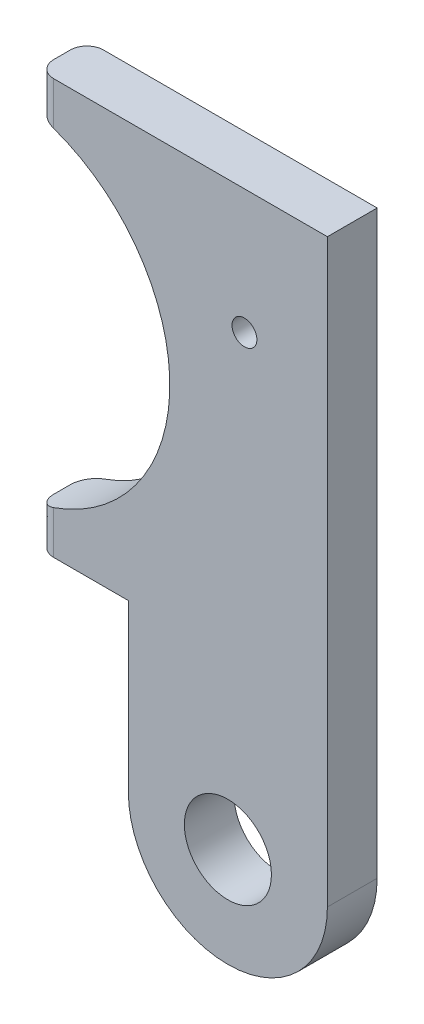
ISO-10303-21;
HEADER;
FILE_DESCRIPTION(('STEP AP214'),'2;1');
FILE_NAME('part.step','',(''),(''),'','','');
FILE_SCHEMA(('AUTOMOTIVE_DESIGN { 1 0 10303 214 1 1 1 1 }'));
ENDSEC;
DATA;
#1=APPLICATION_CONTEXT('core data for automotive mechanical design processes');
#2=APPLICATION_PROTOCOL_DEFINITION('international standard','automotive_design',2000,#1);
#3=PRODUCT_CONTEXT('',#1,'mechanical');
#4=PRODUCT('Part','Part','',(#3));
#5=PRODUCT_RELATED_PRODUCT_CATEGORY('part','',(#4));
#6=PRODUCT_DEFINITION_FORMATION('','',#4);
#7=PRODUCT_DEFINITION_CONTEXT('part definition',#1,'design');
#8=PRODUCT_DEFINITION('design','',#6,#7);
#9=PRODUCT_DEFINITION_SHAPE('','',#8);
#10=(LENGTH_UNIT() NAMED_UNIT(*) SI_UNIT(.MILLI.,.METRE.));
#11=(NAMED_UNIT(*) PLANE_ANGLE_UNIT() SI_UNIT($,.RADIAN.));
#12=(NAMED_UNIT(*) SI_UNIT($,.STERADIAN.) SOLID_ANGLE_UNIT());
#13=UNCERTAINTY_MEASURE_WITH_UNIT(LENGTH_MEASURE(1.E-05),#10,'distance_accuracy_value','');
#14=(GEOMETRIC_REPRESENTATION_CONTEXT(3) GLOBAL_UNCERTAINTY_ASSIGNED_CONTEXT((#13)) GLOBAL_UNIT_ASSIGNED_CONTEXT((#10,
#11,#12)) REPRESENTATION_CONTEXT('',''));
#15=CARTESIAN_POINT('',(0.,0.,0.));
#16=DIRECTION('',(0.,0.,1.));
#17=DIRECTION('',(1.,0.,0.));
#18=AXIS2_PLACEMENT_3D('',#15,#16,#17);
#19=CARTESIAN_POINT('',(-11.5,0.,3.));
#20=DIRECTION('',(1.,0.,0.));
#21=DIRECTION('',(0.,1.,0.));
#22=AXIS2_PLACEMENT_3D('',#19,#20,#21);
#23=PLANE('',#22);
#24=CARTESIAN_POINT('',(-11.5,85.,1.));
#25=CARTESIAN_POINT('',(-11.5,68.3333333333333,1.));
#26=CARTESIAN_POINT('',(-11.5,51.6666666666667,1.));
#27=CARTESIAN_POINT('',(-11.5,35.,1.));
#28=CARTESIAN_POINT('',(-11.5,26.6666666666667,1.));
#29=CARTESIAN_POINT('',(-11.5,18.3333333333333,1.));
#30=CARTESIAN_POINT('',(-11.5,10.,1.));
#31=CARTESIAN_POINT('',(-11.5,-6.66666666666667,1.));
#32=CARTESIAN_POINT('',(-11.5,-23.3333333333333,1.));
#33=CARTESIAN_POINT('',(-11.5,-40.,1.));
#34=(BOUNDED_CURVE() B_SPLINE_CURVE(3,(#24,#25,#26,#27,#28,#29,#30,#31,#32,#33),.UNSPECIFIED.,
.F.,.F.) B_SPLINE_CURVE_WITH_KNOTS((4,3,3,4),(-0.085,-0.035,-0.01,0.04),
.UNSPECIFIED.) CURVE() GEOMETRIC_REPRESENTATION_ITEM() RATIONAL_B_SPLINE_CURVE((1.,1.,1.,1.,1.,
1.,1.,1.,1.,1.)) REPRESENTATION_ITEM(''));
#35=CARTESIAN_POINT('',(-11.5,35.,1.));
#36=VERTEX_POINT('',#35);
#37=CARTESIAN_POINT('',(-11.5,32.6980390271856,1.));
#38=VERTEX_POINT('',#37);
#39=EDGE_CURVE('E174',#36,#38,#34,.T.);
#40=ORIENTED_EDGE('',*,*,#39,.T.);
#41=DIRECTION('',(0.,0.,1.));
#42=VECTOR('',#41,1.);
#43=CARTESIAN_POINT('',(-11.5,32.6980390271856,-0.057371207120285));
#44=LINE('',#43,#42);
#45=CARTESIAN_POINT('',(-11.5,32.6980390271856,2.));
#46=VERTEX_POINT('',#45);
#47=EDGE_CURVE('E164',#46,#38,#44,.F.);
#48=ORIENTED_EDGE('',*,*,#47,.F.);
#49=CARTESIAN_POINT('',(-11.5,85.,2.));
#50=CARTESIAN_POINT('',(-11.5,68.3333333333333,2.));
#51=CARTESIAN_POINT('',(-11.5,51.6666666666667,2.));
#52=CARTESIAN_POINT('',(-11.5,35.,2.));
#53=CARTESIAN_POINT('',(-11.5,26.6666666666667,2.));
#54=CARTESIAN_POINT('',(-11.5,18.3333333333333,2.));
#55=CARTESIAN_POINT('',(-11.5,10.,2.));
#56=CARTESIAN_POINT('',(-11.5,-6.66666666666667,2.));
#57=CARTESIAN_POINT('',(-11.5,-23.3333333333333,2.));
#58=CARTESIAN_POINT('',(-11.5,-40.,2.));
#59=(BOUNDED_CURVE() B_SPLINE_CURVE(3,(#49,#50,#51,#52,#53,#54,#55,#56,#57,#58),.UNSPECIFIED.,
.F.,.F.) B_SPLINE_CURVE_WITH_KNOTS((4,3,3,4),(-0.085,-0.035,-0.01,0.04),
.UNSPECIFIED.) CURVE() GEOMETRIC_REPRESENTATION_ITEM() RATIONAL_B_SPLINE_CURVE((1.,1.,1.,1.,1.,
1.,1.,1.,1.,1.)) REPRESENTATION_ITEM(''));
#60=CARTESIAN_POINT('',(-11.5,35.,2.));
#61=VERTEX_POINT('',#60);
#62=EDGE_CURVE('E172',#46,#61,#59,.F.);
#63=ORIENTED_EDGE('',*,*,#62,.T.);
#64=DIRECTION('',(0.,0.,-1.));
#65=VECTOR('',#64,1.);
#66=CARTESIAN_POINT('',(-11.5,35.,3.));
#67=LINE('',#66,#65);
#68=EDGE_CURVE('E483',#61,#36,#67,.T.);
#69=ORIENTED_EDGE('',*,*,#68,.T.);
#70=EDGE_LOOP('',(#40,#48,#63,#69));
#71=FACE_BOUND('',#70,.T.);
#72=ADVANCED_FACE('F54',(#71),#23,.F.);
#73=CARTESIAN_POINT('',(-11.5,40.,1.));
#74=CARTESIAN_POINT('',(-11.5,38.3333333333333,1.));
#75=CARTESIAN_POINT('',(-11.5,36.6666666666667,1.));
#76=CARTESIAN_POINT('',(-11.5,35.,1.));
#77=CARTESIAN_POINT('',(-11.5,26.6666666666667,1.));
#78=CARTESIAN_POINT('',(-11.5,18.3333333333333,1.));
#79=CARTESIAN_POINT('',(-11.5,10.,1.));
#80=CARTESIAN_POINT('',(-11.5,8.33333333333333,1.));
#81=CARTESIAN_POINT('',(-11.5,6.66666666666666,1.));
#82=CARTESIAN_POINT('',(-11.5,5.,1.));
#83=CARTESIAN_POINT('',(-11.5,40.,0.));
#84=CARTESIAN_POINT('',(-11.5,38.3333333333333,0.));
#85=CARTESIAN_POINT('',(-11.5,36.6666666666667,0.));
#86=CARTESIAN_POINT('',(-11.5,35.,0.));
#87=CARTESIAN_POINT('',(-11.5,26.6666666666667,0.));
#88=CARTESIAN_POINT('',(-11.5,18.3333333333333,0.));
#89=CARTESIAN_POINT('',(-11.5,10.,0.));
#90=CARTESIAN_POINT('',(-11.5,8.33333333333333,0.));
#91=CARTESIAN_POINT('',(-11.5,6.66666666666666,0.));
#92=CARTESIAN_POINT('',(-11.5,5.,0.));
#93=CARTESIAN_POINT('',(-10.5,40.,0.));
#94=CARTESIAN_POINT('',(-10.5,38.3333333333333,0.));
#95=CARTESIAN_POINT('',(-10.5,36.6666666666667,0.));
#96=CARTESIAN_POINT('',(-10.5,35.,0.));
#97=CARTESIAN_POINT('',(-10.5,26.6666666666667,0.));
#98=CARTESIAN_POINT('',(-10.5,18.3333333333333,0.));
#99=CARTESIAN_POINT('',(-10.5,10.,0.));
#100=CARTESIAN_POINT('',(-10.5,8.33333333333333,0.));
#101=CARTESIAN_POINT('',(-10.5,6.66666666666666,0.));
#102=CARTESIAN_POINT('',(-10.5,5.,0.));
#103=(BOUNDED_SURFACE() B_SPLINE_SURFACE(2,3,((#73,#74,#75,#76,#77,#78,#79,#80,#81,#82),(#83,
#84,#85,#86,#87,#88,#89,#90,#91,#92),(#93,#94,#95,#96,#97,#98,#99,#100,#101,#102)),
.UNSPECIFIED.,.F.,.F.,.F.) B_SPLINE_SURFACE_WITH_KNOTS((3,3),(4,3,3,4),(0.,1.),(-0.04,-0.035,
-0.01,-0.005),.UNSPECIFIED.) GEOMETRIC_REPRESENTATION_ITEM() RATIONAL_B_SPLINE_SURFACE(((1.,1.,
1.,1.,1.,1.,1.,1.,1.,1.),(0.707106781186548,0.707106781186548,0.707106781186548,
0.707106781186548,0.707106781186548,0.707106781186548,0.707106781186548,0.707106781186548,
0.707106781186548,0.707106781186548),(1.,1.,1.,1.,1.,1.,1.,1.,1.,1.))) REPRESENTATION_ITEM('') SURFACE());
#104=CARTESIAN_POINT('',(-11.5,12.3019609728144,1.));
#105=CARTESIAN_POINT('',(-11.5000002111957,12.3019615692368,0.972523911067477));
#106=CARTESIAN_POINT('',(-11.4988668428944,12.3022386891917,0.94506111821244));
#107=CARTESIAN_POINT('',(-11.4943481477857,12.3033477651507,0.890336327826097));
#108=CARTESIAN_POINT('',(-11.4909631148035,12.3041796487624,0.863074304565112));
#109=CARTESIAN_POINT('',(-11.4774728691763,12.3075053049876,0.781960112831982));
#110=CARTESIAN_POINT('',(-11.4640323550568,12.3108290749227,0.728656291368002));
#111=CARTESIAN_POINT('',(-11.4286959627983,12.3196894402152,0.625139779720297));
#112=CARTESIAN_POINT('',(-11.4067975055738,12.3252267105546,0.57492803782637));
#113=CARTESIAN_POINT('',(-11.3552674528248,12.3384993804894,0.478960402972967));
#114=CARTESIAN_POINT('',(-11.3256360275927,12.3462347316799,0.43320441192115));
#115=CARTESIAN_POINT('',(-11.2593044306694,12.363937024025,0.346974294917843));
#116=CARTESIAN_POINT('',(-11.2225438780983,12.3739231547606,0.306550630604498));
#117=CARTESIAN_POINT('',(-11.1432891797356,12.39599620057,0.232456536205179));
#118=CARTESIAN_POINT('',(-11.1007936518868,12.4080836222316,0.198787738835971));
#119=CARTESIAN_POINT('',(-11.0101586950385,12.4345574455655,0.138146716650751));
#120=CARTESIAN_POINT('',(-10.9618981910819,12.4489969452857,0.111379003370732));
#121=CARTESIAN_POINT('',(-10.8621203487379,12.4796988369225,0.0662616889894607));
#122=CARTESIAN_POINT('',(-10.8106022444382,12.4959616582304,0.0479140760206935));
#123=CARTESIAN_POINT('',(-10.7158276635642,12.5267261175497,0.022583647695032));
#124=CARTESIAN_POINT('',(-10.6728797709566,12.5409680823307,0.0140967926244136));
#125=CARTESIAN_POINT('',(-10.5865862186252,12.5702109084282,0.00280527983994801));
#126=CARTESIAN_POINT('',(-10.5432414405831,12.5852103187585,-9.84894708422682E-06));
#127=CARTESIAN_POINT('',(-10.5,12.6005050633883,0.));
#128=B_SPLINE_CURVE_WITH_KNOTS('',3,(#104,#105,#106,#107,#108,#109,#110,#111,#112,#113,#114,
#115,#116,#117,#118,#119,#120,#121,#122,#123,#124,#125,#126,#127),.UNSPECIFIED.,.F.,.F.,(4,2,2,
2,2,2,2,2,2,2,2,4),(0.,0.0823771619850113,0.164743576478983,0.329110573803168,0.493527731274838,
0.657941268321545,0.823813465212696,0.989725706845216,1.16010119557458,1.33051689225556,
1.4682771805447,1.60578290352192),.UNSPECIFIED.);
#129=CARTESIAN_POINT('',(-11.5,12.3019609728144,1.));
#130=VERTEX_POINT('',#129);
#131=CARTESIAN_POINT('',(-10.5,12.6005050633883,0.));
#132=VERTEX_POINT('',#131);
#133=EDGE_CURVE('E153',#130,#132,#128,.T.);
#134=CARTESIAN_POINT('',(-10.5,85.,0.));
#135=CARTESIAN_POINT('',(-10.5,68.3333333333333,0.));
#136=CARTESIAN_POINT('',(-10.5,51.6666666666667,0.));
#137=CARTESIAN_POINT('',(-10.5,35.,0.));
#138=CARTESIAN_POINT('',(-10.5,26.6666666666667,0.));
#139=CARTESIAN_POINT('',(-10.5,18.3333333333333,0.));
#140=CARTESIAN_POINT('',(-10.5,10.,0.));
#141=CARTESIAN_POINT('',(-10.5,-6.66666666666667,0.));
#142=CARTESIAN_POINT('',(-10.5,-23.3333333333333,0.));
#143=CARTESIAN_POINT('',(-10.5,-40.,0.));
#144=(BOUNDED_CURVE() B_SPLINE_CURVE(3,(#134,#135,#136,#137,#138,#139,#140,#141,#142,#143),
.UNSPECIFIED.,.F.,.F.) B_SPLINE_CURVE_WITH_KNOTS((4,3,3,4),(-0.085,-0.035,-0.01,0.04),
.UNSPECIFIED.) CURVE() GEOMETRIC_REPRESENTATION_ITEM() RATIONAL_B_SPLINE_CURVE((1.,1.,1.,1.,1.,
1.,1.,1.,1.,1.)) REPRESENTATION_ITEM(''));
#145=CARTESIAN_POINT('',(-10.5,10.,0.));
#146=VERTEX_POINT('',#145);
#147=EDGE_CURVE('E216',#146,#132,#144,.F.);
#148=CARTESIAN_POINT('',(-11.5,10.,1.));
#149=CARTESIAN_POINT('',(-11.4999997996185,10.,0.971865254432972));
#150=CARTESIAN_POINT('',(-11.4988119032098,10.,0.943743998294751));
#151=CARTESIAN_POINT('',(-11.4940728849558,10.,0.88770268367173));
#152=CARTESIAN_POINT('',(-11.4905218736389,10.,0.859782615838623));
#153=CARTESIAN_POINT('',(-11.4763578457214,10.,0.776673062715144));
#154=CARTESIAN_POINT('',(-11.4622337417672,10.,0.722040247925385));
#155=CARTESIAN_POINT('',(-11.4250149037354,10.,0.615923079973702));
#156=CARTESIAN_POINT('',(-11.4019158622525,10.,0.564440252360828));
#157=CARTESIAN_POINT('',(-11.3474030418845,10.,0.466083923996782));
#158=CARTESIAN_POINT('',(-11.3159907277453,10.,0.419209613247622));
#159=CARTESIAN_POINT('',(-11.2457470917003,10.,0.331400542138593));
#160=CARTESIAN_POINT('',(-11.2069150570088,10.,0.290466353089878));
#161=CARTESIAN_POINT('',(-11.1229041961312,10.,0.215686012738716));
#162=CARTESIAN_POINT('',(-11.0777254722674,10.,0.181839747185592));
#163=CARTESIAN_POINT('',(-11.0062109947204,10.,0.137129745737251));
#164=CARTESIAN_POINT('',(-10.9817269025462,10.,0.123227438478842));
#165=CARTESIAN_POINT('',(-10.9316995735737,10.,0.097544618643551));
#166=CARTESIAN_POINT('',(-10.9061572983413,10.,0.0857622295688718));
#167=CARTESIAN_POINT('',(-10.8281796273028,10.,0.0537191639682964));
#168=CARTESIAN_POINT('',(-10.7743436000231,10.,0.0367315233233404));
#169=CARTESIAN_POINT('',(-10.6834905911766,10.,0.0162826143833998));
#170=CARTESIAN_POINT('',(-10.647036002075,10.,0.0101806058722241));
#171=CARTESIAN_POINT('',(-10.5737283254992,10.,0.00204095716132475));
#172=CARTESIAN_POINT('',(-10.5368758777553,10.,-2.44500328447076E-06));
#173=CARTESIAN_POINT('',(-10.5,10.,0.));
#174=B_SPLINE_CURVE_WITH_KNOTS('',3,(#148,#149,#150,#151,#152,#153,#154,#155,#156,#157,#158,
#159,#160,#161,#162,#163,#164,#165,#166,#167,#168,#169,#170,#171,#172,#173),.UNSPECIFIED.,.F.,
.F.,(4,2,2,2,2,2,2,2,2,2,2,2,4),(0.,0.0843523719680465,0.16870079885765,0.337119301179932,
0.505618733832972,0.674088497696926,0.842574453982349,1.01105769422313,1.09543727445699,
1.17974179257302,1.34817695086743,1.45885920377359,1.56938420949917),.UNSPECIFIED.);
#175=CARTESIAN_POINT('',(-11.5,10.,1.));
#176=VERTEX_POINT('',#175);
#177=EDGE_CURVE('E217',#176,#146,#174,.T.);
#178=EDGE_CURVE('E171',#130,#176,#34,.T.);
#179=ORIENTED_EDGE('',*,*,#133,.T.);
#180=ORIENTED_EDGE('',*,*,#147,.F.);
#181=ORIENTED_EDGE('',*,*,#177,.F.);
#182=ORIENTED_EDGE('',*,*,#178,.F.);
#183=EDGE_LOOP('',(#179,#180,#181,#182));
#184=FACE_BOUND('',#183,.T.);
#185=ADVANCED_FACE('F270',(#184),#103,.T.);
#186=CARTESIAN_POINT('',(-10.5,40.,3.));
#187=CARTESIAN_POINT('',(-10.5,38.3333333333333,3.));
#188=CARTESIAN_POINT('',(-10.5,36.6666666666667,3.));
#189=CARTESIAN_POINT('',(-10.5,35.,3.));
#190=CARTESIAN_POINT('',(-10.5,26.6666666666667,3.));
#191=CARTESIAN_POINT('',(-10.5,18.3333333333333,3.));
#192=CARTESIAN_POINT('',(-10.5,10.,3.));
#193=CARTESIAN_POINT('',(-10.5,8.33333333333334,3.));
#194=CARTESIAN_POINT('',(-10.5,6.66666666666667,3.));
#195=CARTESIAN_POINT('',(-10.5,5.,3.));
#196=CARTESIAN_POINT('',(-11.5,40.,3.));
#197=CARTESIAN_POINT('',(-11.5,38.3333333333333,3.));
#198=CARTESIAN_POINT('',(-11.5,36.6666666666667,3.));
#199=CARTESIAN_POINT('',(-11.5,35.,3.));
#200=CARTESIAN_POINT('',(-11.5,26.6666666666667,3.));
#201=CARTESIAN_POINT('',(-11.5,18.3333333333333,3.));
#202=CARTESIAN_POINT('',(-11.5,10.,3.));
#203=CARTESIAN_POINT('',(-11.5,8.33333333333334,3.));
#204=CARTESIAN_POINT('',(-11.5,6.66666666666667,3.));
#205=CARTESIAN_POINT('',(-11.5,5.,3.));
#206=CARTESIAN_POINT('',(-11.5,40.,2.));
#207=CARTESIAN_POINT('',(-11.5,38.3333333333333,2.));
#208=CARTESIAN_POINT('',(-11.5,36.6666666666667,2.));
#209=CARTESIAN_POINT('',(-11.5,35.,2.));
#210=CARTESIAN_POINT('',(-11.5,26.6666666666667,2.));
#211=CARTESIAN_POINT('',(-11.5,18.3333333333333,2.));
#212=CARTESIAN_POINT('',(-11.5,10.,2.));
#213=CARTESIAN_POINT('',(-11.5,8.33333333333334,2.));
#214=CARTESIAN_POINT('',(-11.5,6.66666666666667,2.));
#215=CARTESIAN_POINT('',(-11.5,5.,2.));
#216=(BOUNDED_SURFACE() B_SPLINE_SURFACE(2,3,((#186,#187,#188,#189,#190,#191,#192,#193,#194,
#195),(#196,#197,#198,#199,#200,#201,#202,#203,#204,#205),(#206,#207,#208,#209,#210,#211,#212,
#213,#214,#215)),.UNSPECIFIED.,.F.,.F.,.F.) B_SPLINE_SURFACE_WITH_KNOTS((3,3),(4,3,3,4),(0.,1.),
(-0.04,-0.035,-0.01,-0.005),
.UNSPECIFIED.) GEOMETRIC_REPRESENTATION_ITEM() RATIONAL_B_SPLINE_SURFACE(((1.,1.,1.,1.,1.,1.,1.,
1.,1.,1.),(0.707106781186548,0.707106781186548,0.707106781186548,0.707106781186548,
0.707106781186548,0.707106781186548,0.707106781186548,0.707106781186547,0.707106781186547,
0.707106781186547),(1.,1.,1.,1.,1.,1.,1.,1.,1.,1.))) REPRESENTATION_ITEM('') SURFACE());
#217=CARTESIAN_POINT('',(-10.5000000000001,12.6005050633883,3.));
#218=CARTESIAN_POINT('',(-10.5573458732895,12.5802089615334,3.0000375183836));
#219=CARTESIAN_POINT('',(-10.6148969039209,12.5604431581918,2.99506592222897));
#220=CARTESIAN_POINT('',(-10.7288326640502,12.5223767289034,2.97517516535494));
#221=CARTESIAN_POINT('',(-10.785215749027,12.5040780768707,2.96024284689736));
#222=CARTESIAN_POINT('',(-10.8951708756653,12.4693773664533,2.92046820046921));
#223=CARTESIAN_POINT('',(-10.9487380274338,12.452978551346,2.89560923886832));
#224=CARTESIAN_POINT('',(-11.0254478535743,12.430106477146,2.85133919999911));
#225=CARTESIAN_POINT('',(-11.0504051602336,12.4227717714015,2.83542379997823));
#226=CARTESIAN_POINT('',(-11.0989490682131,12.4086897575949,2.80133667680289));
#227=CARTESIAN_POINT('',(-11.1225341481167,12.401943097535,2.78316251675713));
#228=CARTESIAN_POINT('',(-11.1891064901645,12.3831356867833,2.72692025447202));
#229=CARTESIAN_POINT('',(-11.2299383724103,12.3719090613185,2.68595661295454));
#230=CARTESIAN_POINT('',(-11.304140427077,12.3519052649443,2.59724338644039));
#231=CARTESIAN_POINT('',(-11.3375132234341,12.3431272324053,2.54949619743925));
#232=CARTESIAN_POINT('',(-11.3804917184655,12.331992155308,2.47488837349156));
#233=CARTESIAN_POINT('',(-11.3934436341892,12.3286669729074,2.45004773163042));
#234=CARTESIAN_POINT('',(-11.4172329250587,12.3226003336153,2.39933463061563));
#235=CARTESIAN_POINT('',(-11.4280721166228,12.3198583751093,2.37346308104546));
#236=CARTESIAN_POINT('',(-11.4572685296383,12.3125112097999,2.29456732106042));
#237=CARTESIAN_POINT('',(-11.4723481179757,12.3087735830821,2.24018647591323));
#238=CARTESIAN_POINT('',(-11.4884886713191,12.3047882336953,2.15445923586435));
#239=CARTESIAN_POINT('',(-11.4928035450487,12.3037271630671,2.12371291402643));
#240=CARTESIAN_POINT('',(-11.4985569101425,12.3023146648192,2.06198453931804));
#241=CARTESIAN_POINT('',(-11.4999998767255,12.3019621330932,2.03100292884575));
#242=CARTESIAN_POINT('',(-11.5,12.3019609728144,2.));
#243=B_SPLINE_CURVE_WITH_KNOTS('',3,(#217,#218,#219,#220,#221,#222,#223,#224,#225,#226,#227,
#228,#229,#230,#231,#232,#233,#234,#235,#236,#237,#238,#239,#240,#241,#242),.UNSPECIFIED.,.F.,
.F.,(4,2,2,2,2,2,2,2,2,2,2,2,4),(0.,0.182308812652221,0.364858926524605,0.54771622372869,
0.63909892556475,0.730581086803408,0.906390401186341,1.08213777218383,1.16667909758048,
1.25114741467802,1.41982378157319,1.51289996961079,1.60583100551612),.UNSPECIFIED.);
#244=CARTESIAN_POINT('',(-10.5,12.6005050633883,3.));
#245=VERTEX_POINT('',#244);
#246=CARTESIAN_POINT('',(-11.5,12.3019609728144,2.));
#247=VERTEX_POINT('',#246);
#248=EDGE_CURVE('E151',#245,#247,#243,.T.);
#249=CARTESIAN_POINT('',(-11.5,10.,2.));
#250=VERTEX_POINT('',#249);
#251=EDGE_CURVE('E163',#250,#247,#59,.F.);
#252=CARTESIAN_POINT('',(-10.5,10.,3.));
#253=CARTESIAN_POINT('',(-10.528134745567,10.,2.99999979961845));
#254=CARTESIAN_POINT('',(-10.5562560017052,10.,2.99881190320978));
#255=CARTESIAN_POINT('',(-10.6122973163283,10.,2.99407288495582));
#256=CARTESIAN_POINT('',(-10.6402173841614,10.,2.9905218736389));
#257=CARTESIAN_POINT('',(-10.7233269372849,10.,2.97635784572144));
#258=CARTESIAN_POINT('',(-10.7779597520746,10.,2.96223374176716));
#259=CARTESIAN_POINT('',(-10.8840769200263,10.,2.92501490373544));
#260=CARTESIAN_POINT('',(-10.9355597476392,10.,2.9019158622525));
#261=CARTESIAN_POINT('',(-11.0339160760032,10.,2.84740304188448));
#262=CARTESIAN_POINT('',(-11.0807903867524,10.,2.81599072774534));
#263=CARTESIAN_POINT('',(-11.1685994578614,10.,2.74574709170028));
#264=CARTESIAN_POINT('',(-11.2095336469101,10.,2.70691505700882));
#265=CARTESIAN_POINT('',(-11.2843139872613,10.,2.62290419613123));
#266=CARTESIAN_POINT('',(-11.3181602528144,10.,2.5777254722674));
#267=CARTESIAN_POINT('',(-11.3628702542627,10.,2.50621099472043));
#268=CARTESIAN_POINT('',(-11.3767725615212,10.,2.48172690254622));
#269=CARTESIAN_POINT('',(-11.4024553813564,10.,2.4316995735737));
#270=CARTESIAN_POINT('',(-11.4142377704311,10.,2.40615729834129));
#271=CARTESIAN_POINT('',(-11.4462808360317,10.,2.32817962730277));
#272=CARTESIAN_POINT('',(-11.4632684766767,10.,2.27434360002306));
#273=CARTESIAN_POINT('',(-11.4837173856166,10.,2.18349059117661));
#274=CARTESIAN_POINT('',(-11.4898193941278,10.,2.14703600207499));
#275=CARTESIAN_POINT('',(-11.4979590428387,10.,2.07372832549923));
#276=CARTESIAN_POINT('',(-11.5000024450033,10.,2.03687587775534));
#277=CARTESIAN_POINT('',(-11.5,10.,2.));
#278=B_SPLINE_CURVE_WITH_KNOTS('',3,(#252,#253,#254,#255,#256,#257,#258,#259,#260,#261,#262,
#263,#264,#265,#266,#267,#268,#269,#270,#271,#272,#273,#274,#275,#276,#277),.UNSPECIFIED.,.F.,
.F.,(4,2,2,2,2,2,2,2,2,2,2,2,4),(0.,0.084352371968045,0.168700798857648,0.337119301179932,
0.505618733832973,0.674088497696926,0.84257445398235,1.01105769422313,1.095437274457,
1.17974179257302,1.34817695086743,1.45885920377359,1.56938420949918),.UNSPECIFIED.);
#279=CARTESIAN_POINT('',(-10.5,10.,3.));
#280=VERTEX_POINT('',#279);
#281=EDGE_CURVE('E198',#280,#250,#278,.T.);
#282=CARTESIAN_POINT('',(-10.5,85.,3.));
#283=CARTESIAN_POINT('',(-10.5,68.3333333333333,3.));
#284=CARTESIAN_POINT('',(-10.5,51.6666666666667,3.));
#285=CARTESIAN_POINT('',(-10.5,35.,3.));
#286=CARTESIAN_POINT('',(-10.5,26.6666666666667,3.));
#287=CARTESIAN_POINT('',(-10.5,18.3333333333333,3.));
#288=CARTESIAN_POINT('',(-10.5,10.,3.));
#289=CARTESIAN_POINT('',(-10.5,-6.66666666666667,3.));
#290=CARTESIAN_POINT('',(-10.5,-23.3333333333333,3.));
#291=CARTESIAN_POINT('',(-10.5,-40.,3.));
#292=(BOUNDED_CURVE() B_SPLINE_CURVE(3,(#282,#283,#284,#285,#286,#287,#288,#289,#290,#291),
.UNSPECIFIED.,.F.,.F.) B_SPLINE_CURVE_WITH_KNOTS((4,3,3,4),(-0.085,-0.035,-0.01,0.04),
.UNSPECIFIED.) CURVE() GEOMETRIC_REPRESENTATION_ITEM() RATIONAL_B_SPLINE_CURVE((1.,1.,1.,1.,1.,
1.,1.,1.,1.,1.)) REPRESENTATION_ITEM(''));
#293=EDGE_CURVE('E66',#245,#280,#292,.T.);
#294=ORIENTED_EDGE('',*,*,#248,.T.);
#295=ORIENTED_EDGE('',*,*,#251,.F.);
#296=ORIENTED_EDGE('',*,*,#281,.F.);
#297=ORIENTED_EDGE('',*,*,#293,.F.);
#298=EDGE_LOOP('',(#294,#295,#296,#297));
#299=FACE_BOUND('',#298,.T.);
#300=ADVANCED_FACE('F161',(#299),#216,.T.);
#301=CARTESIAN_POINT('',(0.,0.,3.));
#302=DIRECTION('',(0.,0.,-1.));
#303=DIRECTION('',(-1.,0.,0.));
#304=AXIS2_PLACEMENT_3D('',#301,#302,#303);
#305=CYLINDRICAL_SURFACE('',#304,6.);
#306=CARTESIAN_POINT('',(0.,0.,0.));
#307=DIRECTION('',(0.,0.,1.));
#308=DIRECTION('',(1.,0.,0.));
#309=AXIS2_PLACEMENT_3D('',#306,#307,#308);
#310=CIRCLE('',#309,6.);
#311=CARTESIAN_POINT('',(-6.,0.,0.));
#312=VERTEX_POINT('',#311);
#313=CARTESIAN_POINT('',(6.,0.,0.));
#314=VERTEX_POINT('',#313);
#315=EDGE_CURVE('E454',#312,#314,#310,.T.);
#316=ORIENTED_EDGE('',*,*,#315,.T.);
#317=DIRECTION('',(0.,0.,-1.));
#318=VECTOR('',#317,1.);
#319=CARTESIAN_POINT('',(6.,0.,3.));
#320=LINE('',#319,#318);
#321=CARTESIAN_POINT('',(6.,0.,3.));
#322=VERTEX_POINT('',#321);
#323=EDGE_CURVE('E176',#322,#314,#320,.T.);
#324=ORIENTED_EDGE('',*,*,#323,.F.);
#325=CARTESIAN_POINT('',(0.,0.,3.));
#326=DIRECTION('',(0.,0.,1.));
#327=DIRECTION('',(1.,0.,0.));
#328=AXIS2_PLACEMENT_3D('',#325,#326,#327);
#329=CIRCLE('',#328,6.);
#330=CARTESIAN_POINT('',(-6.,0.,3.));
#331=VERTEX_POINT('',#330);
#332=EDGE_CURVE('E517',#331,#322,#329,.T.);
#333=ORIENTED_EDGE('',*,*,#332,.F.);
#334=DIRECTION('',(0.,0.,-1.));
#335=VECTOR('',#334,1.);
#336=CARTESIAN_POINT('',(-6.,0.,3.));
#337=LINE('',#336,#335);
#338=EDGE_CURVE('E477',#331,#312,#337,.T.);
#339=ORIENTED_EDGE('',*,*,#338,.T.);
#340=EDGE_LOOP('',(#316,#324,#333,#339));
#341=FACE_BOUND('',#340,.T.);
#342=ADVANCED_FACE('F250',(#341),#305,.T.);
#343=CARTESIAN_POINT('',(6.,0.,3.));
#344=DIRECTION('',(-1.,0.,0.));
#345=DIRECTION('',(0.,0.,1.));
#346=AXIS2_PLACEMENT_3D('',#343,#344,#345);
#347=PLANE('',#346);
#348=DIRECTION('',(0.,1.,0.));
#349=VECTOR('',#348,1.);
#350=CARTESIAN_POINT('',(6.,0.,0.));
#351=LINE('',#350,#349);
#352=CARTESIAN_POINT('',(6.,35.,0.));
#353=VERTEX_POINT('',#352);
#354=EDGE_CURVE('E458',#314,#353,#351,.T.);
#355=ORIENTED_EDGE('',*,*,#354,.T.);
#356=DIRECTION('',(0.,0.,-1.));
#357=VECTOR('',#356,1.);
#358=CARTESIAN_POINT('',(6.,35.,3.));
#359=LINE('',#358,#357);
#360=CARTESIAN_POINT('',(6.,35.,3.));
#361=VERTEX_POINT('',#360);
#362=EDGE_CURVE('E485',#361,#353,#359,.T.);
#363=ORIENTED_EDGE('',*,*,#362,.F.);
#364=DIRECTION('',(0.,1.,0.));
#365=VECTOR('',#364,1.);
#366=CARTESIAN_POINT('',(6.,0.,3.));
#367=LINE('',#366,#365);
#368=EDGE_CURVE('E491',#322,#361,#367,.T.);
#369=ORIENTED_EDGE('',*,*,#368,.F.);
#370=ORIENTED_EDGE('',*,*,#323,.T.);
#371=EDGE_LOOP('',(#355,#363,#369,#370));
#372=FACE_BOUND('',#371,.T.);
#373=ADVANCED_FACE('F246',(#372),#347,.F.);
#374=CARTESIAN_POINT('',(0.,35.,3.));
#375=DIRECTION('',(0.,-1.,0.));
#376=DIRECTION('',(0.,0.,-1.));
#377=AXIS2_PLACEMENT_3D('',#374,#375,#376);
#378=PLANE('',#377);
#379=DIRECTION('',(-1.,0.,0.));
#380=VECTOR('',#379,1.);
#381=CARTESIAN_POINT('',(0.,35.,0.));
#382=LINE('',#381,#380);
#383=CARTESIAN_POINT('',(-10.5,35.,0.));
#384=VERTEX_POINT('',#383);
#385=EDGE_CURVE('E465',#353,#384,#382,.T.);
#386=ORIENTED_EDGE('',*,*,#385,.T.);
#387=CARTESIAN_POINT('',(-10.5,35.,0.));
#388=CARTESIAN_POINT('',(-10.528134745567,35.,2.0038154817115E-07));
#389=CARTESIAN_POINT('',(-10.5562560017052,35.,0.00118809679022485));
#390=CARTESIAN_POINT('',(-10.6122973163283,35.,0.00592711504418035));
#391=CARTESIAN_POINT('',(-10.6402173841614,35.,0.00947812636110437));
#392=CARTESIAN_POINT('',(-10.7233269372849,35.,0.0236421542785591));
#393=CARTESIAN_POINT('',(-10.7779597520746,35.,0.0377662582328391));
#394=CARTESIAN_POINT('',(-10.8840769200263,35.,0.0749850962645601));
#395=CARTESIAN_POINT('',(-10.9355597476392,35.,0.0980841377475002));
#396=CARTESIAN_POINT('',(-11.0339160760032,35.,0.152596958115516));
#397=CARTESIAN_POINT('',(-11.0807903867524,35.,0.184009272254657));
#398=CARTESIAN_POINT('',(-11.1685994578614,35.,0.254252908299715));
#399=CARTESIAN_POINT('',(-11.2095336469101,35.,0.29308494299118));
#400=CARTESIAN_POINT('',(-11.2843139872613,35.,0.377095803868768));
#401=CARTESIAN_POINT('',(-11.3181602528144,35.,0.422274527732598));
#402=CARTESIAN_POINT('',(-11.3628702542627,35.,0.493789005279562));
#403=CARTESIAN_POINT('',(-11.3767725615212,35.,0.518273097453774));
#404=CARTESIAN_POINT('',(-11.4024553813564,35.,0.568300426426298));
#405=CARTESIAN_POINT('',(-11.4142377704311,35.,0.593842701658703));
#406=CARTESIAN_POINT('',(-11.4462808360317,35.,0.671820372697225));
#407=CARTESIAN_POINT('',(-11.4632684766767,35.,0.725656399976932));
#408=CARTESIAN_POINT('',(-11.4837173856166,35.,0.816509408823386));
#409=CARTESIAN_POINT('',(-11.4898193941278,35.,0.852963997925001));
#410=CARTESIAN_POINT('',(-11.4979590428387,35.,0.92627167450077));
#411=CARTESIAN_POINT('',(-11.5000024450033,35.,0.963124122244663));
#412=CARTESIAN_POINT('',(-11.5,35.,1.));
#413=B_SPLINE_CURVE_WITH_KNOTS('',3,(#387,#388,#389,#390,#391,#392,#393,#394,#395,#396,#397,
#398,#399,#400,#401,#402,#403,#404,#405,#406,#407,#408,#409,#410,#411,#412),.UNSPECIFIED.,.F.,
.F.,(4,2,2,2,2,2,2,2,2,2,2,2,4),(0.,0.084352371968045,0.168700798857648,0.337119301179928,
0.505618733832967,0.674088497696919,0.842574453982341,1.01105769422312,1.09543727445699,
1.17974179257301,1.34817695086742,1.45885920377358,1.56938420949917),.UNSPECIFIED.);
#414=EDGE_CURVE('E236',#384,#36,#413,.T.);
#415=ORIENTED_EDGE('',*,*,#414,.T.);
#416=ORIENTED_EDGE('',*,*,#68,.F.);
#417=CARTESIAN_POINT('',(-11.5,35.,2.));
#418=CARTESIAN_POINT('',(-11.4999997996185,35.,2.02813474556703));
#419=CARTESIAN_POINT('',(-11.4988119032098,35.,2.05625600170525));
#420=CARTESIAN_POINT('',(-11.4940728849558,35.,2.11229731632827));
#421=CARTESIAN_POINT('',(-11.4905218736389,35.,2.14021738416138));
#422=CARTESIAN_POINT('',(-11.4763578457214,35.,2.22332693728486));
#423=CARTESIAN_POINT('',(-11.4622337417672,35.,2.27795975207461));
#424=CARTESIAN_POINT('',(-11.4250149037354,35.,2.3840769200263));
#425=CARTESIAN_POINT('',(-11.4019158622525,35.,2.43555974763917));
#426=CARTESIAN_POINT('',(-11.3474030418845,35.,2.53391607600322));
#427=CARTESIAN_POINT('',(-11.3159907277453,35.,2.58079038675238));
#428=CARTESIAN_POINT('',(-11.2457470917003,35.,2.66859945786141));
#429=CARTESIAN_POINT('',(-11.2069150570088,35.,2.70953364691012));
#430=CARTESIAN_POINT('',(-11.1229041961312,35.,2.78431398726128));
#431=CARTESIAN_POINT('',(-11.0777254722674,35.,2.81816025281441));
#432=CARTESIAN_POINT('',(-11.0062109947204,35.,2.86287025426275));
#433=CARTESIAN_POINT('',(-10.9817269025462,35.,2.87677256152116));
#434=CARTESIAN_POINT('',(-10.9316995735737,35.,2.90245538135645));
#435=CARTESIAN_POINT('',(-10.9061572983413,35.,2.91423777043113));
#436=CARTESIAN_POINT('',(-10.8281796273028,35.,2.9462808360317));
#437=CARTESIAN_POINT('',(-10.7743436000231,35.,2.96326847667666));
#438=CARTESIAN_POINT('',(-10.6834905911766,35.,2.9837173856166));
#439=CARTESIAN_POINT('',(-10.647036002075,35.,2.98981939412778));
#440=CARTESIAN_POINT('',(-10.5737283254992,35.,2.99795904283868));
#441=CARTESIAN_POINT('',(-10.5368758777553,35.,3.00000244500329));
#442=CARTESIAN_POINT('',(-10.5,35.,3.));
#443=B_SPLINE_CURVE_WITH_KNOTS('',3,(#417,#418,#419,#420,#421,#422,#423,#424,#425,#426,#427,
#428,#429,#430,#431,#432,#433,#434,#435,#436,#437,#438,#439,#440,#441,#442),.UNSPECIFIED.,.F.,
.F.,(4,2,2,2,2,2,2,2,2,2,2,2,4),(0.,0.0843523719680468,0.16870079885765,0.337119301179931,
0.505618733832972,0.674088497696924,0.842574453982346,1.01105769422312,1.09543727445699,
1.17974179257301,1.34817695086743,1.45885920377358,1.56938420949917),.UNSPECIFIED.);
#444=CARTESIAN_POINT('',(-10.5,35.,3.));
#445=VERTEX_POINT('',#444);
#446=EDGE_CURVE('E82',#61,#445,#443,.T.);
#447=ORIENTED_EDGE('',*,*,#446,.T.);
#448=DIRECTION('',(-1.,0.,0.));
#449=VECTOR('',#448,1.);
#450=CARTESIAN_POINT('',(0.,35.,3.));
#451=LINE('',#450,#449);
#452=EDGE_CURVE('E520',#361,#445,#451,.T.);
#453=ORIENTED_EDGE('',*,*,#452,.F.);
#454=ORIENTED_EDGE('',*,*,#362,.T.);
#455=EDGE_LOOP('',(#386,#415,#416,#447,#453,#454));
#456=FACE_BOUND('',#455,.T.);
#457=ADVANCED_FACE('F241',(#456),#378,.F.);
#458=ORIENTED_EDGE('',*,*,#251,.T.);
#459=DIRECTION('',(0.,0.,1.));
#460=VECTOR('',#459,1.);
#461=CARTESIAN_POINT('',(-11.5,12.3019609728144,-0.057371207120285));
#462=LINE('',#461,#460);
#463=EDGE_CURVE('E148',#130,#247,#462,.T.);
#464=ORIENTED_EDGE('',*,*,#463,.F.);
#465=ORIENTED_EDGE('',*,*,#178,.T.);
#466=DIRECTION('',(0.,0.,-1.));
#467=VECTOR('',#466,1.);
#468=CARTESIAN_POINT('',(-11.5,10.,3.));
#469=LINE('',#468,#467);
#470=EDGE_CURVE('E170',#250,#176,#469,.T.);
#471=ORIENTED_EDGE('',*,*,#470,.F.);
#472=EDGE_LOOP('',(#458,#464,#465,#471));
#473=FACE_BOUND('',#472,.T.);
#474=ADVANCED_FACE('F168',(#473),#23,.F.);
#475=CARTESIAN_POINT('',(0.,10.,3.));
#476=DIRECTION('',(0.,1.,0.));
#477=DIRECTION('',(0.,0.,1.));
#478=AXIS2_PLACEMENT_3D('',#475,#476,#477);
#479=PLANE('',#478);
#480=ORIENTED_EDGE('',*,*,#470,.T.);
#481=ORIENTED_EDGE('',*,*,#177,.T.);
#482=DIRECTION('',(1.,0.,0.));
#483=VECTOR('',#482,1.);
#484=CARTESIAN_POINT('',(0.,10.,0.));
#485=LINE('',#484,#483);
#486=CARTESIAN_POINT('',(-6.,10.,0.));
#487=VERTEX_POINT('',#486);
#488=EDGE_CURVE('E468',#146,#487,#485,.T.);
#489=ORIENTED_EDGE('',*,*,#488,.T.);
#490=DIRECTION('',(0.,0.,-1.));
#491=VECTOR('',#490,1.);
#492=CARTESIAN_POINT('',(-6.,10.,3.));
#493=LINE('',#492,#491);
#494=CARTESIAN_POINT('',(-6.,10.,3.));
#495=VERTEX_POINT('',#494);
#496=EDGE_CURVE('E479',#495,#487,#493,.T.);
#497=ORIENTED_EDGE('',*,*,#496,.F.);
#498=DIRECTION('',(1.,0.,0.));
#499=VECTOR('',#498,1.);
#500=CARTESIAN_POINT('',(0.,10.,3.));
#501=LINE('',#500,#499);
#502=EDGE_CURVE('E504',#280,#495,#501,.T.);
#503=ORIENTED_EDGE('',*,*,#502,.F.);
#504=ORIENTED_EDGE('',*,*,#281,.T.);
#505=EDGE_LOOP('',(#480,#481,#489,#497,#503,#504));
#506=FACE_BOUND('',#505,.T.);
#507=ADVANCED_FACE('F375',(#506),#479,.F.);
#508=CARTESIAN_POINT('',(-6.,0.,3.));
#509=DIRECTION('',(-1.,0.,0.));
#510=DIRECTION('',(0.,0.,1.));
#511=AXIS2_PLACEMENT_3D('',#508,#509,#510);
#512=PLANE('',#511);
#513=DIRECTION('',(0.,1.,0.));
#514=VECTOR('',#513,1.);
#515=CARTESIAN_POINT('',(-6.,0.,0.));
#516=LINE('',#515,#514);
#517=EDGE_CURVE('E470',#312,#487,#516,.T.);
#518=ORIENTED_EDGE('',*,*,#517,.F.);
#519=ORIENTED_EDGE('',*,*,#338,.F.);
#520=DIRECTION('',(0.,1.,0.));
#521=VECTOR('',#520,1.);
#522=CARTESIAN_POINT('',(-6.,0.,3.));
#523=LINE('',#522,#521);
#524=EDGE_CURVE('E502',#331,#495,#523,.T.);
#525=ORIENTED_EDGE('',*,*,#524,.T.);
#526=ORIENTED_EDGE('',*,*,#496,.T.);
#527=EDGE_LOOP('',(#518,#519,#525,#526));
#528=FACE_BOUND('',#527,.T.);
#529=ADVANCED_FACE('F258',(#528),#512,.T.);
#530=CARTESIAN_POINT('',(0.,0.,3.));
#531=DIRECTION('',(0.,0.,-1.));
#532=DIRECTION('',(-1.,0.,0.));
#533=AXIS2_PLACEMENT_3D('',#530,#531,#532);
#534=CYLINDRICAL_SURFACE('',#533,2.625);
#535=CARTESIAN_POINT('',(0.,0.,3.));
#536=DIRECTION('',(0.,0.,1.));
#537=DIRECTION('',(1.,0.,0.));
#538=AXIS2_PLACEMENT_3D('',#535,#536,#537);
#539=CIRCLE('',#538,2.625);
#540=CARTESIAN_POINT('',(2.625,0.,3.));
#541=VERTEX_POINT('',#540);
#542=EDGE_CURVE('E476',#541,#541,#539,.T.);
#543=ORIENTED_EDGE('',*,*,#542,.T.);
#544=EDGE_LOOP('',(#543));
#545=FACE_BOUND('',#544,.T.);
#546=CARTESIAN_POINT('',(0.,0.,0.));
#547=DIRECTION('',(0.,0.,1.));
#548=DIRECTION('',(1.,0.,0.));
#549=AXIS2_PLACEMENT_3D('',#546,#547,#548);
#550=CIRCLE('',#549,2.625);
#551=CARTESIAN_POINT('',(2.625,0.,0.));
#552=VERTEX_POINT('',#551);
#553=EDGE_CURVE('E449',#552,#552,#550,.T.);
#554=ORIENTED_EDGE('',*,*,#553,.F.);
#555=EDGE_LOOP('',(#554));
#556=FACE_BOUND('',#555,.T.);
#557=ADVANCED_FACE('F255',(#545,#556),#534,.F.);
#558=CARTESIAN_POINT('',(1.,27.5,3.));
#559=DIRECTION('',(0.,0.,-1.));
#560=DIRECTION('',(-1.,0.,0.));
#561=AXIS2_PLACEMENT_3D('',#558,#559,#560);
#562=CYLINDRICAL_SURFACE('',#561,0.75);
#563=CARTESIAN_POINT('',(1.,27.5,3.));
#564=DIRECTION('',(0.,0.,1.));
#565=DIRECTION('',(1.,0.,0.));
#566=AXIS2_PLACEMENT_3D('',#563,#564,#565);
#567=CIRCLE('',#566,0.75);
#568=CARTESIAN_POINT('',(1.75,27.5,3.));
#569=VERTEX_POINT('',#568);
#570=EDGE_CURVE('E461',#569,#569,#567,.T.);
#571=ORIENTED_EDGE('',*,*,#570,.T.);
#572=EDGE_LOOP('',(#571));
#573=FACE_BOUND('',#572,.T.);
#574=CARTESIAN_POINT('',(1.,27.5,0.));
#575=DIRECTION('',(0.,0.,1.));
#576=DIRECTION('',(1.,0.,0.));
#577=AXIS2_PLACEMENT_3D('',#574,#575,#576);
#578=CIRCLE('',#577,0.75);
#579=CARTESIAN_POINT('',(1.75,27.5,0.));
#580=VERTEX_POINT('',#579);
#581=EDGE_CURVE('E473',#580,#580,#578,.T.);
#582=ORIENTED_EDGE('',*,*,#581,.F.);
#583=EDGE_LOOP('',(#582));
#584=FACE_BOUND('',#583,.T.);
#585=ADVANCED_FACE('F257',(#573,#584),#562,.F.);
#586=CARTESIAN_POINT('',(0.,0.,3.));
#587=DIRECTION('',(0.,0.,1.));
#588=DIRECTION('',(1.,0.,0.));
#589=AXIS2_PLACEMENT_3D('',#586,#587,#588);
#590=PLANE('',#589);
#591=CARTESIAN_POINT('',(-14.,22.5,3.));
#592=DIRECTION('',(0.,0.,1.));
#593=DIRECTION('',(1.,0.,0.));
#594=AXIS2_PLACEMENT_3D('',#591,#592,#593);
#595=CIRCLE('',#594,10.5);
#596=CARTESIAN_POINT('',(-10.5,32.3994949366117,3.));
#597=VERTEX_POINT('',#596);
#598=EDGE_CURVE('E74',#245,#597,#595,.T.);
#599=ORIENTED_EDGE('',*,*,#598,.F.);
#600=ORIENTED_EDGE('',*,*,#293,.T.);
#601=ORIENTED_EDGE('',*,*,#502,.T.);
#602=ORIENTED_EDGE('',*,*,#524,.F.);
#603=ORIENTED_EDGE('',*,*,#332,.T.);
#604=ORIENTED_EDGE('',*,*,#368,.T.);
#605=ORIENTED_EDGE('',*,*,#452,.T.);
#606=EDGE_CURVE('E13',#445,#597,#292,.T.);
#607=ORIENTED_EDGE('',*,*,#606,.T.);
#608=EDGE_LOOP('',(#599,#600,#601,#602,#603,#604,#605,#607));
#609=FACE_BOUND('',#608,.T.);
#610=ORIENTED_EDGE('',*,*,#542,.F.);
#611=EDGE_LOOP('',(#610));
#612=FACE_BOUND('',#611,.T.);
#613=ORIENTED_EDGE('',*,*,#570,.F.);
#614=EDGE_LOOP('',(#613));
#615=FACE_BOUND('',#614,.T.);
#616=ADVANCED_FACE('F364',(#609,#612,#615),#590,.T.);
#617=CARTESIAN_POINT('',(0.,0.,0.));
#618=DIRECTION('',(0.,0.,1.));
#619=DIRECTION('',(1.,0.,0.));
#620=AXIS2_PLACEMENT_3D('',#617,#618,#619);
#621=PLANE('',#620);
#622=ORIENTED_EDGE('',*,*,#553,.T.);
#623=EDGE_LOOP('',(#622));
#624=FACE_BOUND('',#623,.T.);
#625=ORIENTED_EDGE('',*,*,#147,.T.);
#626=CARTESIAN_POINT('',(-14.,22.5,0.));
#627=DIRECTION('',(0.,0.,1.));
#628=DIRECTION('',(1.,0.,0.));
#629=AXIS2_PLACEMENT_3D('',#626,#627,#628);
#630=CIRCLE('',#629,10.5);
#631=CARTESIAN_POINT('',(-10.5,32.3994949366117,0.));
#632=VERTEX_POINT('',#631);
#633=EDGE_CURVE('E429',#632,#132,#630,.F.);
#634=ORIENTED_EDGE('',*,*,#633,.F.);
#635=EDGE_CURVE('E213',#632,#384,#144,.F.);
#636=ORIENTED_EDGE('',*,*,#635,.T.);
#637=ORIENTED_EDGE('',*,*,#385,.F.);
#638=ORIENTED_EDGE('',*,*,#354,.F.);
#639=ORIENTED_EDGE('',*,*,#315,.F.);
#640=ORIENTED_EDGE('',*,*,#517,.T.);
#641=ORIENTED_EDGE('',*,*,#488,.F.);
#642=EDGE_LOOP('',(#625,#634,#636,#637,#638,#639,#640,#641));
#643=FACE_BOUND('',#642,.T.);
#644=ORIENTED_EDGE('',*,*,#581,.T.);
#645=EDGE_LOOP('',(#644));
#646=FACE_BOUND('',#645,.T.);
#647=ADVANCED_FACE('F268',(#624,#643,#646),#621,.F.);
#648=CARTESIAN_POINT('',(-10.5,32.3994949366117,0.));
#649=CARTESIAN_POINT('',(-10.5573458732894,32.4197910384666,-3.75183836084884E-05));
#650=CARTESIAN_POINT('',(-10.6148969039207,32.4395568418082,0.00493407777101399));
#651=CARTESIAN_POINT('',(-10.72883266405,32.4776232710966,0.0248248346450162));
#652=CARTESIAN_POINT('',(-10.7852157490268,32.4959219231292,0.0397571531025792));
#653=CARTESIAN_POINT('',(-10.8951708756651,32.5306226335466,0.0795317995307037));
#654=CARTESIAN_POINT('',(-10.9487380274335,32.5470214486539,0.104390761131567));
#655=CARTESIAN_POINT('',(-11.0254478535741,32.5698935228539,0.148660800000743));
#656=CARTESIAN_POINT('',(-11.0504051602334,32.5772282285984,0.164576200021604));
#657=CARTESIAN_POINT('',(-11.0989490682129,32.591310242405,0.198663323196926));
#658=CARTESIAN_POINT('',(-11.1225341481164,32.5980569024649,0.216837483242673));
#659=CARTESIAN_POINT('',(-11.1891064901642,32.6168643132166,0.27307974552775));
#660=CARTESIAN_POINT('',(-11.2299383724101,32.6280909386814,0.314043387045216));
#661=CARTESIAN_POINT('',(-11.3041404270768,32.6480947350557,0.402756613559347));
#662=CARTESIAN_POINT('',(-11.3375132234339,32.6568727675947,0.450503802560483));
#663=CARTESIAN_POINT('',(-11.3804917184654,32.6680078446919,0.525111626508153));
#664=CARTESIAN_POINT('',(-11.3934436341891,32.6713330270925,0.549952268369285));
#665=CARTESIAN_POINT('',(-11.4172329250586,32.6773996663846,0.600665369384069));
#666=CARTESIAN_POINT('',(-11.4280721166227,32.6801416248907,0.62653691895424));
#667=CARTESIAN_POINT('',(-11.4572685296382,32.6874887902001,0.705432678939273));
#668=CARTESIAN_POINT('',(-11.4723481179756,32.691226416918,0.759813524086457));
#669=CARTESIAN_POINT('',(-11.4884886713191,32.6952117663047,0.845540764135381));
#670=CARTESIAN_POINT('',(-11.4928035450486,32.6962728369329,0.876287085973355));
#671=CARTESIAN_POINT('',(-11.4985569101425,32.6976853351808,0.938015460681857));
#672=CARTESIAN_POINT('',(-11.4999998767255,32.6980378669068,0.9689970711542));
#673=CARTESIAN_POINT('',(-11.5,32.6980390271856,1.));
#674=B_SPLINE_CURVE_WITH_KNOTS('',3,(#648,#649,#650,#651,#652,#653,#654,#655,#656,#657,#658,
#659,#660,#661,#662,#663,#664,#665,#666,#667,#668,#669,#670,#671,#672,#673),.UNSPECIFIED.,.F.,
.F.,(4,2,2,2,2,2,2,2,2,2,2,2,4),(0.,0.182308812652171,0.364858926524506,0.547716223728536,
0.639098925564569,0.730581086803196,0.906390401186132,1.08213777218363,1.16667909758028,
1.25114741467782,1.41982378157299,1.51289996961076,1.60583100551624),.UNSPECIFIED.);
#675=EDGE_CURVE('E157',#632,#38,#674,.T.);
#676=ORIENTED_EDGE('',*,*,#675,.T.);
#677=ORIENTED_EDGE('',*,*,#39,.F.);
#678=ORIENTED_EDGE('',*,*,#414,.F.);
#679=ORIENTED_EDGE('',*,*,#635,.F.);
#680=EDGE_LOOP('',(#676,#677,#678,#679));
#681=FACE_BOUND('',#680,.T.);
#682=ADVANCED_FACE('F261',(#681),#103,.T.);
#683=CARTESIAN_POINT('',(-11.5,32.6980390271856,2.));
#684=CARTESIAN_POINT('',(-11.5000002111957,32.6980384307632,2.02747608893252));
#685=CARTESIAN_POINT('',(-11.4988668428944,32.6977613108083,2.05493888178756));
#686=CARTESIAN_POINT('',(-11.4943481477857,32.6966522348493,2.1096636721739));
#687=CARTESIAN_POINT('',(-11.4909631148035,32.6958203512376,2.13692569543489));
#688=CARTESIAN_POINT('',(-11.4774728691763,32.6924946950124,2.21803988716802));
#689=CARTESIAN_POINT('',(-11.4640323550568,32.6891709250773,2.271343708632));
#690=CARTESIAN_POINT('',(-11.4286959627983,32.6803105597849,2.3748602202797));
#691=CARTESIAN_POINT('',(-11.4067975055738,32.6747732894454,2.42507196217363));
#692=CARTESIAN_POINT('',(-11.3552674528248,32.6615006195106,2.52103959702703));
#693=CARTESIAN_POINT('',(-11.3256360275927,32.6537652683201,2.56679558807885));
#694=CARTESIAN_POINT('',(-11.2593044306694,32.636062975975,2.65302570508216));
#695=CARTESIAN_POINT('',(-11.2225438780983,32.6260768452395,2.6934493693955));
#696=CARTESIAN_POINT('',(-11.1432891797356,32.60400379943,2.76754346379482));
#697=CARTESIAN_POINT('',(-11.1007936518868,32.5919163777684,2.80121226116403));
#698=CARTESIAN_POINT('',(-11.0101586950385,32.5654425544346,2.86185328334925));
#699=CARTESIAN_POINT('',(-10.9618981910819,32.5510030547143,2.88862099662927));
#700=CARTESIAN_POINT('',(-10.8621203487379,32.5203011630775,2.93373831101054));
#701=CARTESIAN_POINT('',(-10.8106022444382,32.5040383417696,2.95208592397931));
#702=CARTESIAN_POINT('',(-10.7158276635642,32.4732738824503,2.97741635230497));
#703=CARTESIAN_POINT('',(-10.6728797709566,32.4590319176693,2.98590320737559));
#704=CARTESIAN_POINT('',(-10.5865862186252,32.4297890915718,2.99719472016005));
#705=CARTESIAN_POINT('',(-10.5432414405831,32.4147896812415,3.00000984894709));
#706=CARTESIAN_POINT('',(-10.5,32.3994949366117,3.));
#707=B_SPLINE_CURVE_WITH_KNOTS('',3,(#683,#684,#685,#686,#687,#688,#689,#690,#691,#692,#693,
#694,#695,#696,#697,#698,#699,#700,#701,#702,#703,#704,#705,#706),.UNSPECIFIED.,.F.,.F.,(4,2,2,
2,2,2,2,2,2,2,2,4),(0.,0.0823771619850104,0.164743576478983,0.329110573803168,0.493527731274838,
0.657941268321542,0.823813465212695,0.989725706845219,1.16010119557458,1.33051689225556,
1.4682771805447,1.60578290352192),.UNSPECIFIED.);
#708=EDGE_CURVE('E165',#46,#597,#707,.T.);
#709=ORIENTED_EDGE('',*,*,#708,.T.);
#710=ORIENTED_EDGE('',*,*,#606,.F.);
#711=ORIENTED_EDGE('',*,*,#446,.F.);
#712=ORIENTED_EDGE('',*,*,#62,.F.);
#713=EDGE_LOOP('',(#709,#710,#711,#712));
#714=FACE_BOUND('',#713,.T.);
#715=ADVANCED_FACE('F57',(#714),#216,.T.);
#716=CARTESIAN_POINT('',(-14.,22.5,-0.057371207120285));
#717=DIRECTION('',(0.,0.,1.));
#718=DIRECTION('',(1.,0.,0.));
#719=AXIS2_PLACEMENT_3D('',#716,#717,#718);
#720=CYLINDRICAL_SURFACE('',#719,10.5);
#721=ORIENTED_EDGE('',*,*,#708,.F.);
#722=ORIENTED_EDGE('',*,*,#47,.T.);
#723=ORIENTED_EDGE('',*,*,#675,.F.);
#724=ORIENTED_EDGE('',*,*,#633,.T.);
#725=ORIENTED_EDGE('',*,*,#133,.F.);
#726=ORIENTED_EDGE('',*,*,#463,.T.);
#727=ORIENTED_EDGE('',*,*,#248,.F.);
#728=ORIENTED_EDGE('',*,*,#598,.T.);
#729=EDGE_LOOP('',(#721,#722,#723,#724,#725,#726,#727,#728));
#730=FACE_BOUND('',#729,.T.);
#731=ADVANCED_FACE('F150',(#730),#720,.F.);
#732=CLOSED_SHELL('',(#72,#185,#300,#342,#373,#457,#474,#507,#529,#557,#585,#616,#647,#682,#715,#731));
#733=MANIFOLD_SOLID_BREP('B2',#732);
#734=ADVANCED_BREP_SHAPE_REPRESENTATION('',(#18,#733),#14);
#735=SHAPE_DEFINITION_REPRESENTATION(#9,#734);
ENDSEC;
END-ISO-10303-21;
